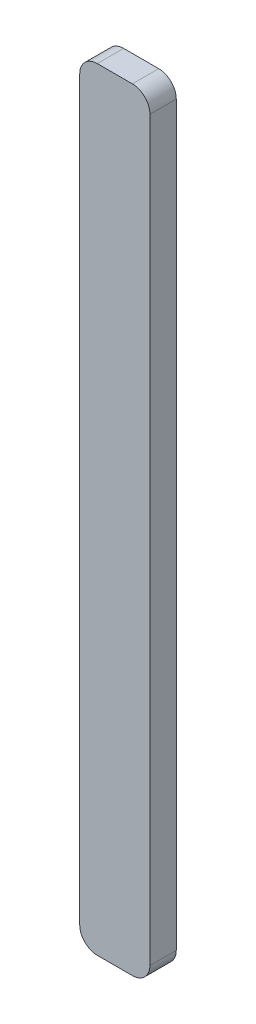
ISO-10303-21;
HEADER;
FILE_DESCRIPTION(('STEP AP214'),'2;1');
FILE_NAME('part.step','',(''),(''),'','','');
FILE_SCHEMA(('AUTOMOTIVE_DESIGN { 1 0 10303 214 1 1 1 1 }'));
ENDSEC;
DATA;
#1=APPLICATION_CONTEXT('core data for automotive mechanical design processes');
#2=APPLICATION_PROTOCOL_DEFINITION('international standard','automotive_design',2000,#1);
#3=PRODUCT_CONTEXT('',#1,'mechanical');
#4=PRODUCT('Part','Part','',(#3));
#5=PRODUCT_RELATED_PRODUCT_CATEGORY('part','',(#4));
#6=PRODUCT_DEFINITION_FORMATION('','',#4);
#7=PRODUCT_DEFINITION_CONTEXT('part definition',#1,'design');
#8=PRODUCT_DEFINITION('design','',#6,#7);
#9=PRODUCT_DEFINITION_SHAPE('','',#8);
#10=(LENGTH_UNIT() NAMED_UNIT(*) SI_UNIT(.MILLI.,.METRE.));
#11=(NAMED_UNIT(*) PLANE_ANGLE_UNIT() SI_UNIT($,.RADIAN.));
#12=(NAMED_UNIT(*) SI_UNIT($,.STERADIAN.) SOLID_ANGLE_UNIT());
#13=UNCERTAINTY_MEASURE_WITH_UNIT(LENGTH_MEASURE(1.E-05),#10,'distance_accuracy_value','');
#14=(GEOMETRIC_REPRESENTATION_CONTEXT(3) GLOBAL_UNCERTAINTY_ASSIGNED_CONTEXT((#13)) GLOBAL_UNIT_ASSIGNED_CONTEXT((#10,
#11,#12)) REPRESENTATION_CONTEXT('',''));
#15=CARTESIAN_POINT('',(0.,0.,0.));
#16=DIRECTION('',(0.,0.,1.));
#17=DIRECTION('',(1.,0.,0.));
#18=AXIS2_PLACEMENT_3D('',#15,#16,#17);
#19=CARTESIAN_POINT('',(-45.479347685781,224.4096,8.8000000000016));
#20=DIRECTION('',(0.,0.,-1.));
#21=DIRECTION('',(0.,-1.,0.));
#22=AXIS2_PLACEMENT_3D('',#19,#20,#21);
#23=PLANE('',#22);
#24=CARTESIAN_POINT('',(-38.0000000000006,213.,8.7999999999804));
#25=DIRECTION('',(-9.64887031962323E-12,-9.89867050016104E-12,1.));
#26=DIRECTION('',(4.81836792687235E-13,1.,9.89867050016569E-12));
#27=AXIS2_PLACEMENT_3D('',#24,#25,#26);
#28=CIRCLE('',#27,2.00000000000035);
#29=CARTESIAN_POINT('',(-36.,213.,8.7999999999997));
#30=VERTEX_POINT('',#29);
#31=CARTESIAN_POINT('',(-38.,215.,8.8000000000002));
#32=VERTEX_POINT('',#31);
#33=EDGE_CURVE('E27',#30,#32,#28,.T.);
#34=ORIENTED_EDGE('',*,*,#33,.T.);
#35=DIRECTION('',(1.,0.,-1.49880108324366E-13));
#36=VECTOR('',#35,1.);
#37=CARTESIAN_POINT('',(-42.,215.,8.8000000000008));
#38=LINE('',#37,#36);
#39=CARTESIAN_POINT('',(-42.,215.,8.8000000000008));
#40=VERTEX_POINT('',#39);
#41=EDGE_CURVE('E183',#40,#32,#38,.T.);
#42=ORIENTED_EDGE('',*,*,#41,.F.);
#43=CARTESIAN_POINT('',(-42.,213.,8.80000000000979));
#44=DIRECTION('',(-4.24535430526538E-12,4.49515448580457E-12,1.));
#45=DIRECTION('',(-1.,-3.37507799486162E-13,-4.24535430526386E-12));
#46=AXIS2_PLACEMENT_3D('',#43,#44,#45);
#47=CIRCLE('',#46,1.99999999999932);
#48=CARTESIAN_POINT('',(-44.,213.,8.8000000000013));
#49=VERTEX_POINT('',#48);
#50=EDGE_CURVE('E72',#40,#49,#47,.T.);
#51=ORIENTED_EDGE('',*,*,#50,.T.);
#52=DIRECTION('',(0.,-1.,0.));
#53=VECTOR('',#52,1.);
#54=CARTESIAN_POINT('',(-44.,213.,8.8000000000013));
#55=LINE('',#54,#53);
#56=CARTESIAN_POINT('',(-44.,129.,8.8000000000013));
#57=VERTEX_POINT('',#56);
#58=EDGE_CURVE('E163',#49,#57,#55,.T.);
#59=ORIENTED_EDGE('',*,*,#58,.T.);
#60=CARTESIAN_POINT('',(-42.,129.,8.8000000000021));
#61=DIRECTION('',(-4.01781902199944E-13,-6.51582082740486E-13,1.));
#62=DIRECTION('',(0.,-1.,-6.51582082740509E-13));
#63=AXIS2_PLACEMENT_3D('',#60,#61,#62);
#64=CIRCLE('',#63,1.99999999999951);
#65=CARTESIAN_POINT('',(-42.,127.,8.8000000000008));
#66=VERTEX_POINT('',#65);
#67=EDGE_CURVE('E139',#57,#66,#64,.T.);
#68=ORIENTED_EDGE('',*,*,#67,.T.);
#69=DIRECTION('',(1.,0.,-2.24820162486605E-13));
#70=VECTOR('',#69,1.);
#71=CARTESIAN_POINT('',(-42.,127.,8.8000000000008));
#72=LINE('',#71,#70);
#73=CARTESIAN_POINT('',(-38.0000000000006,127.,8.7999999999999));
#74=VERTEX_POINT('',#73);
#75=EDGE_CURVE('E124',#66,#74,#72,.T.);
#76=ORIENTED_EDGE('',*,*,#75,.T.);
#77=CARTESIAN_POINT('',(-38.0000000000007,129.,8.80000000001311));
#78=DIRECTION('',(6.65206005053561E-12,-6.6021000144285E-12,1.));
#79=DIRECTION('',(1.,-2.04281036530991E-13,-6.65206005053696E-12));
#80=AXIS2_PLACEMENT_3D('',#77,#78,#79);
#81=CIRCLE('',#80,2.0000000000004);
#82=CARTESIAN_POINT('',(-36.,129.,8.7999999999998));
#83=VERTEX_POINT('',#82);
#84=EDGE_CURVE('E148',#74,#83,#81,.T.);
#85=ORIENTED_EDGE('',*,*,#84,.T.);
#86=DIRECTION('',(0.,1.,0.));
#87=VECTOR('',#86,1.);
#88=CARTESIAN_POINT('',(-36.,129.,8.7999999999998));
#89=LINE('',#88,#87);
#90=EDGE_CURVE('E155',#83,#30,#89,.T.);
#91=ORIENTED_EDGE('',*,*,#90,.T.);
#92=EDGE_LOOP('',(#34,#42,#51,#59,#68,#76,#85,#91));
#93=FACE_BOUND('',#92,.T.);
#94=ADVANCED_FACE('F16',(#93),#23,.F.);
#95=CARTESIAN_POINT('',(-45.479347685781,224.4096,5.8000000000016));
#96=DIRECTION('',(0.,0.,-1.));
#97=DIRECTION('',(0.,-1.,0.));
#98=AXIS2_PLACEMENT_3D('',#95,#96,#97);
#99=PLANE('',#98);
#100=CARTESIAN_POINT('',(-38.0000000000006,213.,5.7999999999804));
#101=DIRECTION('',(9.64887031962323E-12,9.89867050016104E-12,-1.));
#102=DIRECTION('',(4.81836792687235E-13,1.,9.89867050016569E-12));
#103=AXIS2_PLACEMENT_3D('',#100,#101,#102);
#104=CIRCLE('',#103,2.00000000000035);
#105=CARTESIAN_POINT('',(-38.,215.,5.8000000000002));
#106=VERTEX_POINT('',#105);
#107=CARTESIAN_POINT('',(-36.,213.,5.7999999999997));
#108=VERTEX_POINT('',#107);
#109=EDGE_CURVE('E11',#106,#108,#104,.T.);
#110=ORIENTED_EDGE('',*,*,#109,.T.);
#111=DIRECTION('',(0.,-1.,0.));
#112=VECTOR('',#111,1.);
#113=CARTESIAN_POINT('',(-36.,129.,5.7999999999998));
#114=LINE('',#113,#112);
#115=CARTESIAN_POINT('',(-36.,129.,5.7999999999998));
#116=VERTEX_POINT('',#115);
#117=EDGE_CURVE('E159',#108,#116,#114,.T.);
#118=ORIENTED_EDGE('',*,*,#117,.T.);
#119=CARTESIAN_POINT('',(-38.0000000000007,129.,5.8000000000131));
#120=DIRECTION('',(-6.65206005053561E-12,6.6021000144285E-12,-1.));
#121=DIRECTION('',(1.,-2.04281036530991E-13,-6.65206005053696E-12));
#122=AXIS2_PLACEMENT_3D('',#119,#120,#121);
#123=CIRCLE('',#122,2.0000000000004);
#124=CARTESIAN_POINT('',(-38.0000000000006,127.,5.7999999999999));
#125=VERTEX_POINT('',#124);
#126=EDGE_CURVE('E118',#116,#125,#123,.T.);
#127=ORIENTED_EDGE('',*,*,#126,.T.);
#128=DIRECTION('',(-1.,0.,2.24820162486605E-13));
#129=VECTOR('',#128,1.);
#130=CARTESIAN_POINT('',(-42.,127.,5.8000000000008));
#131=LINE('',#130,#129);
#132=CARTESIAN_POINT('',(-42.,127.,5.8000000000008));
#133=VERTEX_POINT('',#132);
#134=EDGE_CURVE('E111',#125,#133,#131,.T.);
#135=ORIENTED_EDGE('',*,*,#134,.T.);
#136=CARTESIAN_POINT('',(-42.,129.,5.8000000000021));
#137=DIRECTION('',(4.01781902199944E-13,6.51582082740486E-13,-1.));
#138=DIRECTION('',(0.,-1.,-6.51582082740509E-13));
#139=AXIS2_PLACEMENT_3D('',#136,#137,#138);
#140=CIRCLE('',#139,1.99999999999951);
#141=CARTESIAN_POINT('',(-44.,129.,5.8000000000013));
#142=VERTEX_POINT('',#141);
#143=EDGE_CURVE('E115',#133,#142,#140,.T.);
#144=ORIENTED_EDGE('',*,*,#143,.T.);
#145=DIRECTION('',(0.,1.,0.));
#146=VECTOR('',#145,1.);
#147=CARTESIAN_POINT('',(-44.,213.,5.8000000000013));
#148=LINE('',#147,#146);
#149=CARTESIAN_POINT('',(-44.,213.,5.8000000000013));
#150=VERTEX_POINT('',#149);
#151=EDGE_CURVE('E158',#142,#150,#148,.T.);
#152=ORIENTED_EDGE('',*,*,#151,.T.);
#153=CARTESIAN_POINT('',(-42.,213.,5.80000000000979));
#154=DIRECTION('',(4.24535430526538E-12,-4.49515448580457E-12,-1.));
#155=DIRECTION('',(-1.,-3.37507799486162E-13,-4.24535430526386E-12));
#156=AXIS2_PLACEMENT_3D('',#153,#154,#155);
#157=CIRCLE('',#156,1.99999999999932);
#158=CARTESIAN_POINT('',(-42.,215.,5.8000000000008));
#159=VERTEX_POINT('',#158);
#160=EDGE_CURVE('E175',#150,#159,#157,.T.);
#161=ORIENTED_EDGE('',*,*,#160,.T.);
#162=DIRECTION('',(1.,0.,-1.49880108324366E-13));
#163=VECTOR('',#162,1.);
#164=CARTESIAN_POINT('',(-42.,215.,5.8000000000008));
#165=LINE('',#164,#163);
#166=EDGE_CURVE('E182',#159,#106,#165,.T.);
#167=ORIENTED_EDGE('',*,*,#166,.T.);
#168=EDGE_LOOP('',(#110,#118,#127,#135,#144,#152,#161,#167));
#169=FACE_BOUND('',#168,.T.);
#170=ADVANCED_FACE('F113',(#169),#99,.T.);
#171=CARTESIAN_POINT('',(-38.0000000000006,213.,8.7999999999804));
#172=DIRECTION('',(0.,0.,-1.));
#173=DIRECTION('',(4.81836792687234E-13,1.,0.));
#174=AXIS2_PLACEMENT_3D('',#171,#172,#173);
#175=CYLINDRICAL_SURFACE('',#174,2.00000000000035);
#176=ORIENTED_EDGE('',*,*,#33,.F.);
#177=DIRECTION('',(0.,0.,-1.));
#178=VECTOR('',#177,1.);
#179=CARTESIAN_POINT('',(-36.,213.,8.7999999999997));
#180=LINE('',#179,#178);
#181=EDGE_CURVE('E161',#30,#108,#180,.T.);
#182=ORIENTED_EDGE('',*,*,#181,.T.);
#183=ORIENTED_EDGE('',*,*,#109,.F.);
#184=DIRECTION('',(0.,0.,-1.));
#185=VECTOR('',#184,1.);
#186=CARTESIAN_POINT('',(-38.,215.,8.8000000000002));
#187=LINE('',#186,#185);
#188=EDGE_CURVE('E180',#32,#106,#187,.T.);
#189=ORIENTED_EDGE('',*,*,#188,.F.);
#190=EDGE_LOOP('',(#176,#182,#183,#189));
#191=FACE_BOUND('',#190,.T.);
#192=ADVANCED_FACE('F18',(#191),#175,.T.);
#193=CARTESIAN_POINT('',(-36.,213.,8.7999999999997));
#194=DIRECTION('',(1.,0.,0.));
#195=DIRECTION('',(0.,-1.,0.));
#196=AXIS2_PLACEMENT_3D('',#193,#194,#195);
#197=PLANE('',#196);
#198=ORIENTED_EDGE('',*,*,#90,.F.);
#199=DIRECTION('',(0.,0.,-1.));
#200=VECTOR('',#199,1.);
#201=CARTESIAN_POINT('',(-36.,129.,8.7999999999998));
#202=LINE('',#201,#200);
#203=EDGE_CURVE('E151',#83,#116,#202,.T.);
#204=ORIENTED_EDGE('',*,*,#203,.T.);
#205=ORIENTED_EDGE('',*,*,#117,.F.);
#206=ORIENTED_EDGE('',*,*,#181,.F.);
#207=EDGE_LOOP('',(#198,#204,#205,#206));
#208=FACE_BOUND('',#207,.T.);
#209=ADVANCED_FACE('F198',(#208),#197,.T.);
#210=CARTESIAN_POINT('',(-38.0000000000007,129.,8.80000000001311));
#211=DIRECTION('',(0.,0.,-1.));
#212=DIRECTION('',(1.,-2.04281036530988E-13,0.));
#213=AXIS2_PLACEMENT_3D('',#210,#211,#212);
#214=CYLINDRICAL_SURFACE('',#213,2.0000000000004);
#215=ORIENTED_EDGE('',*,*,#84,.F.);
#216=DIRECTION('',(0.,0.,-1.));
#217=VECTOR('',#216,1.);
#218=CARTESIAN_POINT('',(-38.0000000000006,127.,8.7999999999999));
#219=LINE('',#218,#217);
#220=EDGE_CURVE('E123',#74,#125,#219,.T.);
#221=ORIENTED_EDGE('',*,*,#220,.T.);
#222=ORIENTED_EDGE('',*,*,#126,.F.);
#223=ORIENTED_EDGE('',*,*,#203,.F.);
#224=EDGE_LOOP('',(#215,#221,#222,#223));
#225=FACE_BOUND('',#224,.T.);
#226=ADVANCED_FACE('F195',(#225),#214,.T.);
#227=CARTESIAN_POINT('',(-38.0000000000006,127.,8.7999999999999));
#228=DIRECTION('',(0.,-1.,0.));
#229=DIRECTION('',(0.,0.,-1.));
#230=AXIS2_PLACEMENT_3D('',#227,#228,#229);
#231=PLANE('',#230);
#232=ORIENTED_EDGE('',*,*,#75,.F.);
#233=DIRECTION('',(0.,0.,-1.));
#234=VECTOR('',#233,1.);
#235=CARTESIAN_POINT('',(-42.,127.,8.8000000000008));
#236=LINE('',#235,#234);
#237=EDGE_CURVE('E127',#66,#133,#236,.T.);
#238=ORIENTED_EDGE('',*,*,#237,.T.);
#239=ORIENTED_EDGE('',*,*,#134,.F.);
#240=ORIENTED_EDGE('',*,*,#220,.F.);
#241=EDGE_LOOP('',(#232,#238,#239,#240));
#242=FACE_BOUND('',#241,.T.);
#243=ADVANCED_FACE('F128',(#242),#231,.T.);
#244=CARTESIAN_POINT('',(-42.,129.,8.8000000000021));
#245=DIRECTION('',(0.,0.,-1.));
#246=DIRECTION('',(0.,-1.,0.));
#247=AXIS2_PLACEMENT_3D('',#244,#245,#246);
#248=CYLINDRICAL_SURFACE('',#247,1.99999999999951);
#249=ORIENTED_EDGE('',*,*,#67,.F.);
#250=DIRECTION('',(0.,0.,-1.));
#251=VECTOR('',#250,1.);
#252=CARTESIAN_POINT('',(-44.,129.,8.8000000000013));
#253=LINE('',#252,#251);
#254=EDGE_CURVE('E136',#57,#142,#253,.T.);
#255=ORIENTED_EDGE('',*,*,#254,.T.);
#256=ORIENTED_EDGE('',*,*,#143,.F.);
#257=ORIENTED_EDGE('',*,*,#237,.F.);
#258=EDGE_LOOP('',(#249,#255,#256,#257));
#259=FACE_BOUND('',#258,.T.);
#260=ADVANCED_FACE('F134',(#259),#248,.T.);
#261=CARTESIAN_POINT('',(-44.,129.,8.8000000000013));
#262=DIRECTION('',(-1.,0.,0.));
#263=DIRECTION('',(0.,0.,1.));
#264=AXIS2_PLACEMENT_3D('',#261,#262,#263);
#265=PLANE('',#264);
#266=ORIENTED_EDGE('',*,*,#58,.F.);
#267=DIRECTION('',(0.,0.,-1.));
#268=VECTOR('',#267,1.);
#269=CARTESIAN_POINT('',(-44.,213.,8.8000000000013));
#270=LINE('',#269,#268);
#271=EDGE_CURVE('E169',#49,#150,#270,.T.);
#272=ORIENTED_EDGE('',*,*,#271,.T.);
#273=ORIENTED_EDGE('',*,*,#151,.F.);
#274=ORIENTED_EDGE('',*,*,#254,.F.);
#275=EDGE_LOOP('',(#266,#272,#273,#274));
#276=FACE_BOUND('',#275,.T.);
#277=ADVANCED_FACE('F241',(#276),#265,.T.);
#278=CARTESIAN_POINT('',(-42.,213.,8.80000000000979));
#279=DIRECTION('',(0.,0.,-1.));
#280=DIRECTION('',(-1.,-3.37507799486163E-13,0.));
#281=AXIS2_PLACEMENT_3D('',#278,#279,#280);
#282=CYLINDRICAL_SURFACE('',#281,1.99999999999932);
#283=ORIENTED_EDGE('',*,*,#50,.F.);
#284=DIRECTION('',(0.,0.,-1.));
#285=VECTOR('',#284,1.);
#286=CARTESIAN_POINT('',(-42.,215.,8.8000000000008));
#287=LINE('',#286,#285);
#288=EDGE_CURVE('E20',#40,#159,#287,.T.);
#289=ORIENTED_EDGE('',*,*,#288,.T.);
#290=ORIENTED_EDGE('',*,*,#160,.F.);
#291=ORIENTED_EDGE('',*,*,#271,.F.);
#292=EDGE_LOOP('',(#283,#289,#290,#291));
#293=FACE_BOUND('',#292,.T.);
#294=ADVANCED_FACE('F214',(#293),#282,.T.);
#295=CARTESIAN_POINT('',(-42.,215.,8.8000000000008));
#296=DIRECTION('',(0.,1.,0.));
#297=DIRECTION('',(1.,0.,0.));
#298=AXIS2_PLACEMENT_3D('',#295,#296,#297);
#299=PLANE('',#298);
#300=ORIENTED_EDGE('',*,*,#41,.T.);
#301=ORIENTED_EDGE('',*,*,#188,.T.);
#302=ORIENTED_EDGE('',*,*,#166,.F.);
#303=ORIENTED_EDGE('',*,*,#288,.F.);
#304=EDGE_LOOP('',(#300,#301,#302,#303));
#305=FACE_BOUND('',#304,.T.);
#306=ADVANCED_FACE('F216',(#305),#299,.T.);
#307=CLOSED_SHELL('',(#94,#170,#192,#209,#226,#243,#260,#277,#294,#306));
#308=MANIFOLD_SOLID_BREP('B1',#307);
#309=ADVANCED_BREP_SHAPE_REPRESENTATION('',(#18,#308),#14);
#310=SHAPE_DEFINITION_REPRESENTATION(#9,#309);
ENDSEC;
END-ISO-10303-21;
